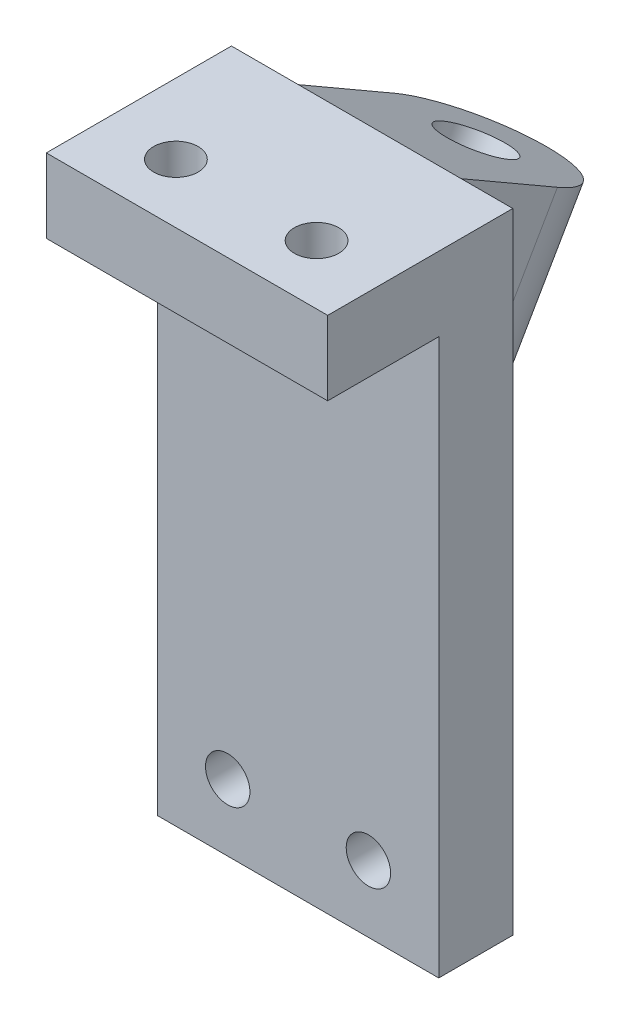
ISO-10303-21;
HEADER;
FILE_DESCRIPTION(('STEP AP214'),'2;1');
FILE_NAME('part.step','',(''),(''),'','','');
FILE_SCHEMA(('AUTOMOTIVE_DESIGN { 1 0 10303 214 1 1 1 1 }'));
ENDSEC;
DATA;
#1=APPLICATION_CONTEXT('core data for automotive mechanical design processes');
#2=APPLICATION_PROTOCOL_DEFINITION('international standard','automotive_design',2000,#1);
#3=PRODUCT_CONTEXT('',#1,'mechanical');
#4=PRODUCT('Part','Part','',(#3));
#5=PRODUCT_RELATED_PRODUCT_CATEGORY('part','',(#4));
#6=PRODUCT_DEFINITION_FORMATION('','',#4);
#7=PRODUCT_DEFINITION_CONTEXT('part definition',#1,'design');
#8=PRODUCT_DEFINITION('design','',#6,#7);
#9=PRODUCT_DEFINITION_SHAPE('','',#8);
#10=(LENGTH_UNIT() NAMED_UNIT(*) SI_UNIT(.MILLI.,.METRE.));
#11=(NAMED_UNIT(*) PLANE_ANGLE_UNIT() SI_UNIT($,.RADIAN.));
#12=(NAMED_UNIT(*) SI_UNIT($,.STERADIAN.) SOLID_ANGLE_UNIT());
#13=UNCERTAINTY_MEASURE_WITH_UNIT(LENGTH_MEASURE(1.E-05),#10,'distance_accuracy_value','');
#14=(GEOMETRIC_REPRESENTATION_CONTEXT(3) GLOBAL_UNCERTAINTY_ASSIGNED_CONTEXT((#13)) GLOBAL_UNIT_ASSIGNED_CONTEXT((#10,
#11,#12)) REPRESENTATION_CONTEXT('',''));
#15=CARTESIAN_POINT('',(0.,0.,0.));
#16=DIRECTION('',(0.,0.,1.));
#17=DIRECTION('',(1.,0.,0.));
#18=AXIS2_PLACEMENT_3D('',#15,#16,#17);
#19=CARTESIAN_POINT('',(0.,20.,0.));
#20=DIRECTION('',(0.,-1.,0.));
#21=DIRECTION('',(0.,0.,-1.));
#22=AXIS2_PLACEMENT_3D('',#19,#20,#21);
#23=PLANE('',#22);
#24=DIRECTION('',(0.,0.,-1.));
#25=VECTOR('',#24,1.);
#26=CARTESIAN_POINT('',(38.,20.,25.));
#27=LINE('',#26,#25);
#28=CARTESIAN_POINT('',(38.,20.,25.));
#29=VERTEX_POINT('',#28);
#30=CARTESIAN_POINT('',(38.,20.,-25.));
#31=VERTEX_POINT('',#30);
#32=EDGE_CURVE('E157',#29,#31,#27,.T.);
#33=ORIENTED_EDGE('',*,*,#32,.T.);
#34=DIRECTION('',(-1.,0.,0.));
#35=VECTOR('',#34,1.);
#36=CARTESIAN_POINT('',(-38.,20.,-25.));
#37=LINE('',#36,#35);
#38=CARTESIAN_POINT('',(24.0680143691403,20.,-25.));
#39=VERTEX_POINT('',#38);
#40=EDGE_CURVE('E156',#31,#39,#37,.T.);
#41=ORIENTED_EDGE('',*,*,#40,.T.);
#42=DIRECTION('',(-1.,0.,0.));
#43=VECTOR('',#42,1.);
#44=CARTESIAN_POINT('',(-19.9319856308597,20.,-25.));
#45=LINE('',#44,#43);
#46=CARTESIAN_POINT('',(-19.9319856308597,20.,-25.));
#47=VERTEX_POINT('',#46);
#48=EDGE_CURVE('E143',#39,#47,#45,.T.);
#49=ORIENTED_EDGE('',*,*,#48,.T.);
#50=CARTESIAN_POINT('',(-38.,20.,-25.));
#51=VERTEX_POINT('',#50);
#52=EDGE_CURVE('E150',#47,#51,#37,.T.);
#53=ORIENTED_EDGE('',*,*,#52,.T.);
#54=DIRECTION('',(0.,0.,1.));
#55=VECTOR('',#54,1.);
#56=CARTESIAN_POINT('',(-38.,20.,25.));
#57=LINE('',#56,#55);
#58=CARTESIAN_POINT('',(-38.,20.,25.));
#59=VERTEX_POINT('',#58);
#60=EDGE_CURVE('E205',#51,#59,#57,.T.);
#61=ORIENTED_EDGE('',*,*,#60,.T.);
#62=DIRECTION('',(1.,0.,0.));
#63=VECTOR('',#62,1.);
#64=CARTESIAN_POINT('',(-38.,20.,25.));
#65=LINE('',#64,#63);
#66=EDGE_CURVE('E207',#59,#29,#65,.T.);
#67=ORIENTED_EDGE('',*,*,#66,.T.);
#68=EDGE_LOOP('',(#33,#41,#49,#53,#61,#67));
#69=FACE_BOUND('',#68,.T.);
#70=CARTESIAN_POINT('',(-19.,20.,9.));
#71=DIRECTION('',(0.,1.,0.));
#72=DIRECTION('',(0.,0.,1.));
#73=AXIS2_PLACEMENT_3D('',#70,#71,#72);
#74=CIRCLE('',#73,6.);
#75=CARTESIAN_POINT('',(-19.,20.,15.));
#76=VERTEX_POINT('',#75);
#77=EDGE_CURVE('E197',#76,#76,#74,.T.);
#78=ORIENTED_EDGE('',*,*,#77,.F.);
#79=EDGE_LOOP('',(#78));
#80=FACE_BOUND('',#79,.T.);
#81=CARTESIAN_POINT('',(19.,20.,9.));
#82=DIRECTION('',(0.,1.,0.));
#83=DIRECTION('',(0.,0.,-1.));
#84=AXIS2_PLACEMENT_3D('',#81,#82,#83);
#85=CIRCLE('',#84,6.);
#86=CARTESIAN_POINT('',(19.,20.,3.));
#87=VERTEX_POINT('',#86);
#88=EDGE_CURVE('E191',#87,#87,#85,.T.);
#89=ORIENTED_EDGE('',*,*,#88,.F.);
#90=EDGE_LOOP('',(#89));
#91=FACE_BOUND('',#90,.T.);
#92=ADVANCED_FACE('F54',(#69,#80,#91),#23,.F.);
#93=CARTESIAN_POINT('',(0.,0.,0.));
#94=DIRECTION('',(0.,-1.,0.));
#95=DIRECTION('',(0.,0.,-1.));
#96=AXIS2_PLACEMENT_3D('',#93,#94,#95);
#97=PLANE('',#96);
#98=DIRECTION('',(-1.,0.,0.));
#99=VECTOR('',#98,1.);
#100=CARTESIAN_POINT('',(-38.,0.,-5.));
#101=LINE('',#100,#99);
#102=CARTESIAN_POINT('',(38.,0.,-5.));
#103=VERTEX_POINT('',#102);
#104=CARTESIAN_POINT('',(-38.,0.,-5.));
#105=VERTEX_POINT('',#104);
#106=EDGE_CURVE('E79',#103,#105,#101,.T.);
#107=ORIENTED_EDGE('',*,*,#106,.F.);
#108=DIRECTION('',(0.,0.,-1.));
#109=VECTOR('',#108,1.);
#110=CARTESIAN_POINT('',(38.,0.,25.));
#111=LINE('',#110,#109);
#112=CARTESIAN_POINT('',(38.,0.,25.));
#113=VERTEX_POINT('',#112);
#114=EDGE_CURVE('E200',#113,#103,#111,.T.);
#115=ORIENTED_EDGE('',*,*,#114,.F.);
#116=DIRECTION('',(1.,0.,0.));
#117=VECTOR('',#116,1.);
#118=CARTESIAN_POINT('',(-38.,0.,25.));
#119=LINE('',#118,#117);
#120=CARTESIAN_POINT('',(-38.,0.,25.));
#121=VERTEX_POINT('',#120);
#122=EDGE_CURVE('E203',#121,#113,#119,.T.);
#123=ORIENTED_EDGE('',*,*,#122,.F.);
#124=DIRECTION('',(0.,0.,1.));
#125=VECTOR('',#124,1.);
#126=CARTESIAN_POINT('',(-38.,0.,25.));
#127=LINE('',#126,#125);
#128=EDGE_CURVE('E211',#105,#121,#127,.T.);
#129=ORIENTED_EDGE('',*,*,#128,.F.);
#130=EDGE_LOOP('',(#107,#115,#123,#129));
#131=FACE_BOUND('',#130,.T.);
#132=CARTESIAN_POINT('',(-19.,0.,9.));
#133=DIRECTION('',(0.,1.,0.));
#134=DIRECTION('',(0.,0.,1.));
#135=AXIS2_PLACEMENT_3D('',#132,#133,#134);
#136=CIRCLE('',#135,6.);
#137=CARTESIAN_POINT('',(-19.,0.,15.));
#138=VERTEX_POINT('',#137);
#139=EDGE_CURVE('E194',#138,#138,#136,.T.);
#140=ORIENTED_EDGE('',*,*,#139,.T.);
#141=EDGE_LOOP('',(#140));
#142=FACE_BOUND('',#141,.T.);
#143=CARTESIAN_POINT('',(19.,0.,9.));
#144=DIRECTION('',(0.,1.,0.));
#145=DIRECTION('',(0.,0.,-1.));
#146=AXIS2_PLACEMENT_3D('',#143,#144,#145);
#147=CIRCLE('',#146,6.);
#148=CARTESIAN_POINT('',(19.,0.,3.));
#149=VERTEX_POINT('',#148);
#150=EDGE_CURVE('E190',#149,#149,#147,.T.);
#151=ORIENTED_EDGE('',*,*,#150,.T.);
#152=EDGE_LOOP('',(#151));
#153=FACE_BOUND('',#152,.T.);
#154=ADVANCED_FACE('F251',(#131,#142,#153),#97,.T.);
#155=CARTESIAN_POINT('',(38.,20.,25.));
#156=DIRECTION('',(-1.,0.,0.));
#157=DIRECTION('',(0.,0.,1.));
#158=AXIS2_PLACEMENT_3D('',#155,#156,#157);
#159=PLANE('',#158);
#160=ORIENTED_EDGE('',*,*,#114,.T.);
#161=DIRECTION('',(0.,1.,0.));
#162=VECTOR('',#161,1.);
#163=CARTESIAN_POINT('',(38.,-150.,-5.));
#164=LINE('',#163,#162);
#165=CARTESIAN_POINT('',(38.,-150.,-5.));
#166=VERTEX_POINT('',#165);
#167=EDGE_CURVE('E187',#166,#103,#164,.T.);
#168=ORIENTED_EDGE('',*,*,#167,.F.);
#169=DIRECTION('',(0.,0.,1.));
#170=VECTOR('',#169,1.);
#171=CARTESIAN_POINT('',(38.,-150.,-25.));
#172=LINE('',#171,#170);
#173=CARTESIAN_POINT('',(38.,-150.,-25.));
#174=VERTEX_POINT('',#173);
#175=EDGE_CURVE('E179',#174,#166,#172,.T.);
#176=ORIENTED_EDGE('',*,*,#175,.F.);
#177=DIRECTION('',(0.,-1.,0.));
#178=VECTOR('',#177,1.);
#179=CARTESIAN_POINT('',(38.,20.,-25.));
#180=LINE('',#179,#178);
#181=EDGE_CURVE('E63',#31,#174,#180,.T.);
#182=ORIENTED_EDGE('',*,*,#181,.F.);
#183=ORIENTED_EDGE('',*,*,#32,.F.);
#184=DIRECTION('',(0.,-1.,0.));
#185=VECTOR('',#184,1.);
#186=CARTESIAN_POINT('',(38.,20.,25.));
#187=LINE('',#186,#185);
#188=EDGE_CURVE('E209',#29,#113,#187,.T.);
#189=ORIENTED_EDGE('',*,*,#188,.T.);
#190=EDGE_LOOP('',(#160,#168,#176,#182,#183,#189));
#191=FACE_BOUND('',#190,.T.);
#192=ADVANCED_FACE('F56',(#191),#159,.F.);
#193=CARTESIAN_POINT('',(-38.,20.,-25.));
#194=DIRECTION('',(0.,0.,1.));
#195=DIRECTION('',(1.,0.,0.));
#196=AXIS2_PLACEMENT_3D('',#193,#194,#195);
#197=PLANE('',#196);
#198=CARTESIAN_POINT('',(19.,-132.,-25.));
#199=DIRECTION('',(0.,0.,-1.));
#200=DIRECTION('',(-1.,0.,0.));
#201=AXIS2_PLACEMENT_3D('',#198,#199,#200);
#202=CIRCLE('',#201,6.);
#203=CARTESIAN_POINT('',(13.,-132.,-25.));
#204=VERTEX_POINT('',#203);
#205=EDGE_CURVE('E167',#204,#204,#202,.T.);
#206=ORIENTED_EDGE('',*,*,#205,.F.);
#207=EDGE_LOOP('',(#206));
#208=FACE_BOUND('',#207,.T.);
#209=CARTESIAN_POINT('',(-19.,-132.,-25.));
#210=DIRECTION('',(0.,0.,-1.));
#211=DIRECTION('',(1.,0.,0.));
#212=AXIS2_PLACEMENT_3D('',#209,#210,#211);
#213=CIRCLE('',#212,6.);
#214=CARTESIAN_POINT('',(-13.,-132.,-25.));
#215=VERTEX_POINT('',#214);
#216=EDGE_CURVE('E147',#215,#215,#213,.T.);
#217=ORIENTED_EDGE('',*,*,#216,.F.);
#218=EDGE_LOOP('',(#217));
#219=FACE_BOUND('',#218,.T.);
#220=ORIENTED_EDGE('',*,*,#52,.F.);
#221=DIRECTION('',(0.,-1.,0.));
#222=VECTOR('',#221,1.);
#223=CARTESIAN_POINT('',(-19.9319856308597,-116.161986088652,-25.));
#224=LINE('',#223,#222);
#225=CARTESIAN_POINT('',(-19.9319856308597,-40.0000000000002,-25.));
#226=VERTEX_POINT('',#225);
#227=EDGE_CURVE('E129',#47,#226,#224,.T.);
#228=ORIENTED_EDGE('',*,*,#227,.T.);
#229=CARTESIAN_POINT('',(2.06801436914032,-40.0000000000003,-25.));
#230=DIRECTION('',(0.,0.,1.));
#231=DIRECTION('',(0.,1.,0.));
#232=AXIS2_PLACEMENT_3D('',#229,#230,#231);
#233=ELLIPSE('',#232,44.0000000000002,22.);
#234=CARTESIAN_POINT('',(24.0680143691403,-40.0000000000003,-25.));
#235=VERTEX_POINT('',#234);
#236=EDGE_CURVE('E137',#226,#235,#233,.T.);
#237=ORIENTED_EDGE('',*,*,#236,.T.);
#238=DIRECTION('',(0.,1.,0.));
#239=VECTOR('',#238,1.);
#240=CARTESIAN_POINT('',(24.0680143691403,-116.161986088652,-25.));
#241=LINE('',#240,#239);
#242=EDGE_CURVE('E162',#235,#39,#241,.T.);
#243=ORIENTED_EDGE('',*,*,#242,.T.);
#244=ORIENTED_EDGE('',*,*,#40,.F.);
#245=ORIENTED_EDGE('',*,*,#181,.T.);
#246=DIRECTION('',(1.,0.,0.));
#247=VECTOR('',#246,1.);
#248=CARTESIAN_POINT('',(-38.,-150.,-25.));
#249=LINE('',#248,#247);
#250=CARTESIAN_POINT('',(-38.,-150.,-25.));
#251=VERTEX_POINT('',#250);
#252=EDGE_CURVE('E176',#251,#174,#249,.T.);
#253=ORIENTED_EDGE('',*,*,#252,.F.);
#254=DIRECTION('',(0.,-1.,0.));
#255=VECTOR('',#254,1.);
#256=CARTESIAN_POINT('',(-38.,20.,-25.));
#257=LINE('',#256,#255);
#258=EDGE_CURVE('E153',#51,#251,#257,.T.);
#259=ORIENTED_EDGE('',*,*,#258,.F.);
#260=EDGE_LOOP('',(#220,#228,#237,#243,#244,#245,#253,#259));
#261=FACE_BOUND('',#260,.T.);
#262=ADVANCED_FACE('F151',(#208,#219,#261),#197,.F.);
#263=CARTESIAN_POINT('',(-38.,20.,25.));
#264=DIRECTION('',(1.,0.,0.));
#265=DIRECTION('',(0.,0.,-1.));
#266=AXIS2_PLACEMENT_3D('',#263,#264,#265);
#267=PLANE('',#266);
#268=ORIENTED_EDGE('',*,*,#258,.T.);
#269=DIRECTION('',(0.,0.,-1.));
#270=VECTOR('',#269,1.);
#271=CARTESIAN_POINT('',(-38.,-150.,-25.));
#272=LINE('',#271,#270);
#273=CARTESIAN_POINT('',(-38.,-150.,-5.));
#274=VERTEX_POINT('',#273);
#275=EDGE_CURVE('E173',#274,#251,#272,.T.);
#276=ORIENTED_EDGE('',*,*,#275,.F.);
#277=DIRECTION('',(0.,1.,0.));
#278=VECTOR('',#277,1.);
#279=CARTESIAN_POINT('',(-38.,-150.,-5.));
#280=LINE('',#279,#278);
#281=EDGE_CURVE('E183',#274,#105,#280,.T.);
#282=ORIENTED_EDGE('',*,*,#281,.T.);
#283=ORIENTED_EDGE('',*,*,#128,.T.);
#284=DIRECTION('',(0.,-1.,0.));
#285=VECTOR('',#284,1.);
#286=CARTESIAN_POINT('',(-38.,20.,25.));
#287=LINE('',#286,#285);
#288=EDGE_CURVE('E216',#59,#121,#287,.T.);
#289=ORIENTED_EDGE('',*,*,#288,.F.);
#290=ORIENTED_EDGE('',*,*,#60,.F.);
#291=EDGE_LOOP('',(#268,#276,#282,#283,#289,#290));
#292=FACE_BOUND('',#291,.T.);
#293=ADVANCED_FACE('F265',(#292),#267,.F.);
#294=CARTESIAN_POINT('',(-38.,20.,25.));
#295=DIRECTION('',(0.,0.,-1.));
#296=DIRECTION('',(-1.,0.,0.));
#297=AXIS2_PLACEMENT_3D('',#294,#295,#296);
#298=PLANE('',#297);
#299=ORIENTED_EDGE('',*,*,#122,.T.);
#300=ORIENTED_EDGE('',*,*,#188,.F.);
#301=ORIENTED_EDGE('',*,*,#66,.F.);
#302=ORIENTED_EDGE('',*,*,#288,.T.);
#303=EDGE_LOOP('',(#299,#300,#301,#302));
#304=FACE_BOUND('',#303,.T.);
#305=ADVANCED_FACE('F262',(#304),#298,.F.);
#306=CARTESIAN_POINT('',(-19.,20.,9.));
#307=DIRECTION('',(0.,-1.,0.));
#308=DIRECTION('',(0.,0.,-1.));
#309=AXIS2_PLACEMENT_3D('',#306,#307,#308);
#310=CYLINDRICAL_SURFACE('',#309,6.);
#311=ORIENTED_EDGE('',*,*,#77,.T.);
#312=EDGE_LOOP('',(#311));
#313=FACE_BOUND('',#312,.T.);
#314=ORIENTED_EDGE('',*,*,#139,.F.);
#315=EDGE_LOOP('',(#314));
#316=FACE_BOUND('',#315,.T.);
#317=ADVANCED_FACE('F259',(#313,#316),#310,.F.);
#318=CARTESIAN_POINT('',(19.,20.,9.));
#319=DIRECTION('',(0.,-1.,0.));
#320=DIRECTION('',(0.,0.,-1.));
#321=AXIS2_PLACEMENT_3D('',#318,#319,#320);
#322=CYLINDRICAL_SURFACE('',#321,6.);
#323=ORIENTED_EDGE('',*,*,#88,.T.);
#324=EDGE_LOOP('',(#323));
#325=FACE_BOUND('',#324,.T.);
#326=ORIENTED_EDGE('',*,*,#150,.F.);
#327=EDGE_LOOP('',(#326));
#328=FACE_BOUND('',#327,.T.);
#329=ADVANCED_FACE('F317',(#325,#328),#322,.F.);
#330=CARTESIAN_POINT('',(-38.,-150.,-5.));
#331=DIRECTION('',(0.,0.,-1.));
#332=DIRECTION('',(-1.,0.,0.));
#333=AXIS2_PLACEMENT_3D('',#330,#331,#332);
#334=PLANE('',#333);
#335=CARTESIAN_POINT('',(19.,-132.,-5.00000000000002));
#336=DIRECTION('',(0.,0.,-1.));
#337=DIRECTION('',(-1.,0.,0.));
#338=AXIS2_PLACEMENT_3D('',#335,#336,#337);
#339=CIRCLE('',#338,6.);
#340=CARTESIAN_POINT('',(13.,-132.,-5.00000000000002));
#341=VERTEX_POINT('',#340);
#342=EDGE_CURVE('E58',#341,#341,#339,.T.);
#343=ORIENTED_EDGE('',*,*,#342,.T.);
#344=EDGE_LOOP('',(#343));
#345=FACE_BOUND('',#344,.T.);
#346=CARTESIAN_POINT('',(-19.,-132.,-5.00000000000002));
#347=DIRECTION('',(0.,0.,-1.));
#348=DIRECTION('',(-1.,0.,0.));
#349=AXIS2_PLACEMENT_3D('',#346,#347,#348);
#350=CIRCLE('',#349,6.);
#351=CARTESIAN_POINT('',(-25.,-132.,-5.00000000000002));
#352=VERTEX_POINT('',#351);
#353=EDGE_CURVE('E170',#352,#352,#350,.T.);
#354=ORIENTED_EDGE('',*,*,#353,.T.);
#355=EDGE_LOOP('',(#354));
#356=FACE_BOUND('',#355,.T.);
#357=ORIENTED_EDGE('',*,*,#106,.T.);
#358=ORIENTED_EDGE('',*,*,#281,.F.);
#359=DIRECTION('',(-1.,0.,0.));
#360=VECTOR('',#359,1.);
#361=CARTESIAN_POINT('',(-38.,-150.,-5.));
#362=LINE('',#361,#360);
#363=EDGE_CURVE('E181',#166,#274,#362,.T.);
#364=ORIENTED_EDGE('',*,*,#363,.F.);
#365=ORIENTED_EDGE('',*,*,#167,.T.);
#366=EDGE_LOOP('',(#357,#358,#364,#365));
#367=FACE_BOUND('',#366,.T.);
#368=ADVANCED_FACE('F226',(#345,#356,#367),#334,.F.);
#369=CARTESIAN_POINT('',(0.,-150.,0.));
#370=DIRECTION('',(0.,1.,0.));
#371=DIRECTION('',(0.,0.,1.));
#372=AXIS2_PLACEMENT_3D('',#369,#370,#371);
#373=PLANE('',#372);
#374=ORIENTED_EDGE('',*,*,#275,.T.);
#375=ORIENTED_EDGE('',*,*,#252,.T.);
#376=ORIENTED_EDGE('',*,*,#175,.T.);
#377=ORIENTED_EDGE('',*,*,#363,.T.);
#378=EDGE_LOOP('',(#374,#375,#376,#377));
#379=FACE_BOUND('',#378,.T.);
#380=ADVANCED_FACE('F243',(#379),#373,.F.);
#381=CARTESIAN_POINT('',(-19.,-132.,125.));
#382=DIRECTION('',(0.,0.,-1.));
#383=DIRECTION('',(-1.,0.,0.));
#384=AXIS2_PLACEMENT_3D('',#381,#382,#383);
#385=CYLINDRICAL_SURFACE('',#384,6.);
#386=ORIENTED_EDGE('',*,*,#216,.T.);
#387=EDGE_LOOP('',(#386));
#388=FACE_BOUND('',#387,.T.);
#389=ORIENTED_EDGE('',*,*,#353,.F.);
#390=EDGE_LOOP('',(#389));
#391=FACE_BOUND('',#390,.T.);
#392=ADVANCED_FACE('F231',(#388,#391),#385,.F.);
#393=CARTESIAN_POINT('',(19.,-132.,125.));
#394=DIRECTION('',(0.,0.,-1.));
#395=DIRECTION('',(-1.,0.,0.));
#396=AXIS2_PLACEMENT_3D('',#393,#394,#395);
#397=CYLINDRICAL_SURFACE('',#396,6.);
#398=ORIENTED_EDGE('',*,*,#205,.T.);
#399=EDGE_LOOP('',(#398));
#400=FACE_BOUND('',#399,.T.);
#401=ORIENTED_EDGE('',*,*,#342,.F.);
#402=EDGE_LOOP('',(#401));
#403=FACE_BOUND('',#402,.T.);
#404=ADVANCED_FACE('F228',(#400,#403),#397,.F.);
#405=CARTESIAN_POINT('',(2.06801436914032,-131.161986088652,27.6323972081438));
#406=DIRECTION('',(0.,0.86602540378444,-0.499999999999998));
#407=DIRECTION('',(0.,0.499999999999998,0.86602540378444));
#408=AXIS2_PLACEMENT_3D('',#405,#406,#407);
#409=CYLINDRICAL_SURFACE('',#408,22.);
#410=ORIENTED_EDGE('',*,*,#236,.F.);
#411=DIRECTION('',(0.,0.86602540378444,-0.499999999999998));
#412=VECTOR('',#411,1.);
#413=CARTESIAN_POINT('',(-19.9319856308597,-131.161986088652,27.6323972081438));
#414=LINE('',#413,#412);
#415=CARTESIAN_POINT('',(-19.9319856308597,5.00000000000008,-50.9807621135332));
#416=VERTEX_POINT('',#415);
#417=EDGE_CURVE('E133',#226,#416,#414,.T.);
#418=ORIENTED_EDGE('',*,*,#417,.T.);
#419=CARTESIAN_POINT('',(2.06801436914032,5.00000000000007,-50.9807621135332));
#420=DIRECTION('',(0.,-0.86602540378444,0.499999999999998));
#421=DIRECTION('',(0.,-0.499999999999998,-0.86602540378444));
#422=AXIS2_PLACEMENT_3D('',#419,#420,#421);
#423=CIRCLE('',#422,22.);
#424=CARTESIAN_POINT('',(24.0680143691403,5.00000000000007,-50.9807621135332));
#425=VERTEX_POINT('',#424);
#426=EDGE_CURVE('E146',#416,#425,#423,.T.);
#427=ORIENTED_EDGE('',*,*,#426,.T.);
#428=DIRECTION('',(0.,0.86602540378444,-0.499999999999998));
#429=VECTOR('',#428,1.);
#430=CARTESIAN_POINT('',(24.0680143691403,-131.161986088652,27.6323972081438));
#431=LINE('',#430,#429);
#432=EDGE_CURVE('E294',#235,#425,#431,.T.);
#433=ORIENTED_EDGE('',*,*,#432,.F.);
#434=EDGE_LOOP('',(#410,#418,#427,#433));
#435=FACE_BOUND('',#434,.T.);
#436=ADVANCED_FACE('F230',(#435),#409,.T.);
#437=CARTESIAN_POINT('',(24.0680143691403,-116.161986088652,53.613159321677));
#438=DIRECTION('',(-1.,0.,0.));
#439=DIRECTION('',(0.,0.,1.));
#440=AXIS2_PLACEMENT_3D('',#437,#438,#439);
#441=PLANE('',#440);
#442=ORIENTED_EDGE('',*,*,#242,.F.);
#443=ORIENTED_EDGE('',*,*,#432,.T.);
#444=DIRECTION('',(0.,0.499999999999998,0.86602540378444));
#445=VECTOR('',#444,1.);
#446=CARTESIAN_POINT('',(24.0680143691403,20.,-25.));
#447=LINE('',#446,#445);
#448=EDGE_CURVE('E71',#425,#39,#447,.T.);
#449=ORIENTED_EDGE('',*,*,#448,.T.);
#450=EDGE_LOOP('',(#442,#443,#449));
#451=FACE_BOUND('',#450,.T.);
#452=ADVANCED_FACE('F239',(#451),#441,.F.);
#453=CARTESIAN_POINT('',(-19.9319856308597,-116.161986088652,53.613159321677));
#454=DIRECTION('',(1.,0.,0.));
#455=DIRECTION('',(0.,0.,-1.));
#456=AXIS2_PLACEMENT_3D('',#453,#454,#455);
#457=PLANE('',#456);
#458=ORIENTED_EDGE('',*,*,#227,.F.);
#459=DIRECTION('',(0.,-0.499999999999998,-0.86602540378444));
#460=VECTOR('',#459,1.);
#461=CARTESIAN_POINT('',(-19.9319856308597,20.,-25.));
#462=LINE('',#461,#460);
#463=EDGE_CURVE('E132',#47,#416,#462,.T.);
#464=ORIENTED_EDGE('',*,*,#463,.T.);
#465=ORIENTED_EDGE('',*,*,#417,.F.);
#466=EDGE_LOOP('',(#458,#464,#465));
#467=FACE_BOUND('',#466,.T.);
#468=ADVANCED_FACE('F131',(#467),#457,.F.);
#469=CARTESIAN_POINT('',(2.06801436914032,-131.161986088652,27.6323972081438));
#470=DIRECTION('',(0.,0.86602540378444,-0.499999999999998));
#471=DIRECTION('',(0.,0.499999999999998,0.86602540378444));
#472=AXIS2_PLACEMENT_3D('',#469,#470,#471);
#473=CYLINDRICAL_SURFACE('',#472,9.);
#474=CARTESIAN_POINT('',(2.06801436914032,5.00000000000007,-50.9807621135332));
#475=DIRECTION('',(0.,-0.86602540378444,0.499999999999998));
#476=DIRECTION('',(0.,-0.499999999999998,-0.86602540378444));
#477=AXIS2_PLACEMENT_3D('',#474,#475,#476);
#478=CIRCLE('',#477,9.);
#479=CARTESIAN_POINT('',(2.06801436914032,0.500000000000096,-58.7749907475932));
#480=VERTEX_POINT('',#479);
#481=EDGE_CURVE('E295',#480,#480,#478,.T.);
#482=ORIENTED_EDGE('',*,*,#481,.F.);
#483=EDGE_LOOP('',(#482));
#484=FACE_BOUND('',#483,.T.);
#485=CARTESIAN_POINT('',(2.06801436914032,-40.0000000000003,-25.));
#486=DIRECTION('',(0.,0.,1.));
#487=DIRECTION('',(0.,1.,0.));
#488=AXIS2_PLACEMENT_3D('',#485,#486,#487);
#489=ELLIPSE('',#488,18.0000000000001,9.);
#490=CARTESIAN_POINT('',(2.06801436914032,-22.0000000000002,-25.));
#491=VERTEX_POINT('',#490);
#492=EDGE_CURVE('E12',#491,#491,#489,.T.);
#493=ORIENTED_EDGE('',*,*,#492,.T.);
#494=EDGE_LOOP('',(#493));
#495=FACE_BOUND('',#494,.T.);
#496=ADVANCED_FACE('F248',(#484,#495),#473,.F.);
#497=CARTESIAN_POINT('',(2.06801436914032,5.00000000000007,-50.9807621135332));
#498=DIRECTION('',(0.,-0.86602540378444,0.499999999999998));
#499=DIRECTION('',(0.,-0.499999999999998,-0.86602540378444));
#500=AXIS2_PLACEMENT_3D('',#497,#498,#499);
#501=PLANE('',#500);
#502=ORIENTED_EDGE('',*,*,#481,.T.);
#503=EDGE_LOOP('',(#502));
#504=FACE_BOUND('',#503,.T.);
#505=ORIENTED_EDGE('',*,*,#463,.F.);
#506=ORIENTED_EDGE('',*,*,#48,.F.);
#507=ORIENTED_EDGE('',*,*,#448,.F.);
#508=ORIENTED_EDGE('',*,*,#426,.F.);
#509=EDGE_LOOP('',(#505,#506,#507,#508));
#510=FACE_BOUND('',#509,.T.);
#511=ADVANCED_FACE('F141',(#504,#510),#501,.F.);
#512=ORIENTED_EDGE('',*,*,#492,.F.);
#513=EDGE_LOOP('',(#512));
#514=FACE_BOUND('',#513,.T.);
#515=ADVANCED_FACE('F242',(#514),#197,.F.);
#516=CLOSED_SHELL('',(#92,#154,#192,#262,#293,#305,#317,#329,#368,#380,#392,#404,#436,#452,#468,
#496,#511,#515));
#517=MANIFOLD_SOLID_BREP('B2',#516);
#518=ADVANCED_BREP_SHAPE_REPRESENTATION('',(#18,#517),#14);
#519=SHAPE_DEFINITION_REPRESENTATION(#9,#518);
ENDSEC;
END-ISO-10303-21;
